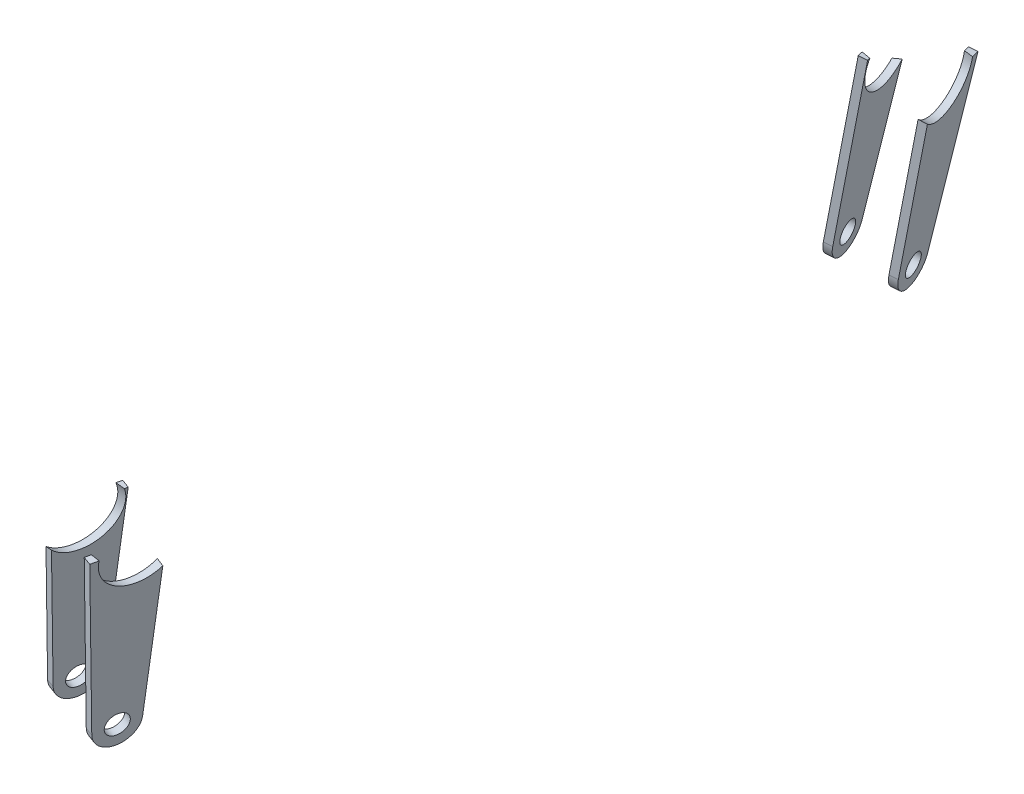
ISO-10303-21;
HEADER;
FILE_DESCRIPTION(('STEP AP214'),'2;1');
FILE_NAME('part.step','',(''),(''),'','','');
FILE_SCHEMA(('AUTOMOTIVE_DESIGN { 1 0 10303 214 1 1 1 1 }'));
ENDSEC;
DATA;
#1=APPLICATION_CONTEXT('core data for automotive mechanical design processes');
#2=APPLICATION_PROTOCOL_DEFINITION('international standard','automotive_design',2000,#1);
#3=PRODUCT_CONTEXT('',#1,'mechanical');
#4=PRODUCT('Part','Part','',(#3));
#5=PRODUCT_RELATED_PRODUCT_CATEGORY('part','',(#4));
#6=PRODUCT_DEFINITION_FORMATION('','',#4);
#7=PRODUCT_DEFINITION_CONTEXT('part definition',#1,'design');
#8=PRODUCT_DEFINITION('design','',#6,#7);
#9=PRODUCT_DEFINITION_SHAPE('','',#8);
#10=(LENGTH_UNIT() NAMED_UNIT(*) SI_UNIT(.MILLI.,.METRE.));
#11=(NAMED_UNIT(*) PLANE_ANGLE_UNIT() SI_UNIT($,.RADIAN.));
#12=(NAMED_UNIT(*) SI_UNIT($,.STERADIAN.) SOLID_ANGLE_UNIT());
#13=UNCERTAINTY_MEASURE_WITH_UNIT(LENGTH_MEASURE(1.E-05),#10,'distance_accuracy_value','');
#14=(GEOMETRIC_REPRESENTATION_CONTEXT(3) GLOBAL_UNCERTAINTY_ASSIGNED_CONTEXT((#13)) GLOBAL_UNIT_ASSIGNED_CONTEXT((#10,
#11,#12)) REPRESENTATION_CONTEXT('',''));
#15=CARTESIAN_POINT('',(0.,0.,0.));
#16=DIRECTION('',(0.,0.,1.));
#17=DIRECTION('',(1.,0.,0.));
#18=AXIS2_PLACEMENT_3D('',#15,#16,#17);
#19=CARTESIAN_POINT('',(1065.05049766154,119.041943768487,147.043758831216));
#20=DIRECTION('',(0.954125194871391,-0.170161980707227,0.246353430731994));
#21=DIRECTION('',(0.24999939562621,0.,-0.968245992600295));
#22=AXIS2_PLACEMENT_3D('',#19,#20,#21);
#23=CYLINDRICAL_SURFACE('',#22,8.00000000000002);
#24=CARTESIAN_POINT('',(1067.91287324616,118.531457826365,147.782819123412));
#25=DIRECTION('',(-0.954125194871391,0.170161980707226,-0.246353430731995));
#26=DIRECTION('',(-0.249999395626211,0.,0.968245992600295));
#27=AXIS2_PLACEMENT_3D('',#24,#25,#26);
#28=CIRCLE('',#27,8.00000000000002);
#29=CARTESIAN_POINT('',(1069.89582801164,118.430520316687,140.033128676873));
#30=VERTEX_POINT('',#29);
#31=CARTESIAN_POINT('',(1065.78095925562,117.670985608352,155.445359844281));
#32=VERTEX_POINT('',#31);
#33=EDGE_CURVE('E60',#30,#32,#28,.T.);
#34=ORIENTED_EDGE('',*,*,#33,.T.);
#35=DIRECTION('',(0.954125194871391,-0.170161980707227,0.246353430731994));
#36=VECTOR('',#35,1.);
#37=CARTESIAN_POINT('',(1062.91858367101,118.181471550474,154.706299552085));
#38=LINE('',#37,#36);
#39=CARTESIAN_POINT('',(1062.91858367101,118.181471550474,154.706299552085));
#40=VERTEX_POINT('',#39);
#41=EDGE_CURVE('E108',#40,#32,#38,.T.);
#42=ORIENTED_EDGE('',*,*,#41,.F.);
#43=CARTESIAN_POINT('',(1065.05049766154,119.041943768487,147.043758831216));
#44=DIRECTION('',(-0.954125194871391,0.170161980707226,-0.246353430731995));
#45=DIRECTION('',(-0.249999395626211,0.,0.968245992600295));
#46=AXIS2_PLACEMENT_3D('',#43,#44,#45);
#47=CIRCLE('',#46,8.00000000000002);
#48=CARTESIAN_POINT('',(1067.03345242703,118.941006258809,139.294068384677));
#49=VERTEX_POINT('',#48);
#50=EDGE_CURVE('E127',#49,#40,#47,.T.);
#51=ORIENTED_EDGE('',*,*,#50,.F.);
#52=DIRECTION('',(0.954125194871391,-0.170161980707227,0.246353430731994));
#53=VECTOR('',#52,1.);
#54=CARTESIAN_POINT('',(1067.03345242703,118.941006258809,139.294068384677));
#55=LINE('',#54,#53);
#56=EDGE_CURVE('E126',#49,#30,#55,.T.);
#57=ORIENTED_EDGE('',*,*,#56,.T.);
#58=EDGE_LOOP('',(#34,#42,#51,#57));
#59=FACE_BOUND('',#58,.T.);
#60=ADVANCED_FACE('F50',(#59),#23,.T.);
#61=CARTESIAN_POINT('',(1024.19346878971,-159.738488235706,112.722702968816));
#62=DIRECTION('',(-0.266489248817151,-0.107559027251607,0.957817590108659));
#63=DIRECTION('',(0.916685898360171,-0.335302185966361,0.217392290189384));
#64=AXIS2_PLACEMENT_3D('',#61,#62,#63);
#65=PLANE('',#64);
#66=DIRECTION('',(-0.136486602919482,-0.979528435512967,-0.147971116252524));
#67=VECTOR('',#66,1.);
#68=CARTESIAN_POINT('',(1024.19346878971,-159.738488235706,112.722702968816));
#69=LINE('',#68,#67);
#70=CARTESIAN_POINT('',(1070.14370431945,170.034261302594,162.539369938052));
#71=VERTEX_POINT('',#70);
#72=EDGE_CURVE('E116',#71,#40,#69,.T.);
#73=ORIENTED_EDGE('',*,*,#72,.T.);
#74=ORIENTED_EDGE('',*,*,#41,.T.);
#75=DIRECTION('',(-0.136486602919482,-0.979528435512967,-0.147971116252524));
#76=VECTOR('',#75,1.);
#77=CARTESIAN_POINT('',(1027.05584437433,-160.248974177827,113.461763261012));
#78=LINE('',#77,#76);
#79=CARTESIAN_POINT('',(1073.18239747289,170.789160157596,163.469583844713));
#80=VERTEX_POINT('',#79);
#81=EDGE_CURVE('E54',#80,#32,#78,.T.);
#82=ORIENTED_EDGE('',*,*,#81,.F.);
#83=CARTESIAN_POINT('',(1036.08419895906,180.045029610102,154.187316707885));
#84=DIRECTION('',(0.266489248817151,0.107559027251607,-0.957817590108659));
#85=DIRECTION('',(-0.963835932642089,0.0277353815954449,-0.265049134229317));
#86=AXIS2_PLACEMENT_3D('',#83,#84,#85);
#87=ELLIPSE('',#86,50.5593865311846,12.7);
#88=EDGE_CURVE('E105',#71,#80,#87,.F.);
#89=ORIENTED_EDGE('',*,*,#88,.F.);
#90=EDGE_LOOP('',(#73,#74,#82,#89));
#91=FACE_BOUND('',#90,.T.);
#92=ADVANCED_FACE('F52',(#91),#65,.T.);
#93=CARTESIAN_POINT('',(1040.93240170606,180.21644974225,282.707621962443));
#94=DIRECTION('',(0.155305579184682,0.98472843470482,0.0786771056782485));
#95=DIRECTION('',(0.861275608896956,-0.173980321013036,0.477425568460027));
#96=AXIS2_PLACEMENT_3D('',#93,#94,#95);
#97=PLANE('',#96);
#98=DIRECTION('',(-0.255979080367402,-0.0368077465432099,0.965981314627084));
#99=VECTOR('',#98,1.);
#100=CARTESIAN_POINT('',(1043.79477729067,179.705963800129,283.446682254639));
#101=LINE('',#100,#99);
#102=CARTESIAN_POINT('',(1081.25814010637,185.092896049425,142.072205828214));
#103=VERTEX_POINT('',#102);
#104=CARTESIAN_POINT('',(1080.95240597408,185.048933923947,143.225946433169));
#105=VERTEX_POINT('',#104);
#106=EDGE_CURVE('E103',#103,#105,#101,.T.);
#107=ORIENTED_EDGE('',*,*,#106,.F.);
#108=DIRECTION('',(0.954125194871391,-0.170161980707227,0.246353430731994));
#109=VECTOR('',#108,1.);
#110=CARTESIAN_POINT('',(1078.39576452176,185.603381991547,141.333145536018));
#111=LINE('',#110,#109);
#112=CARTESIAN_POINT('',(1078.39576452176,185.603381991547,141.333145536018));
#113=VERTEX_POINT('',#112);
#114=EDGE_CURVE('E113',#113,#103,#111,.T.);
#115=ORIENTED_EDGE('',*,*,#114,.F.);
#116=DIRECTION('',(-0.255979080367402,-0.0368077465432099,0.965981314627084));
#117=VECTOR('',#116,1.);
#118=CARTESIAN_POINT('',(1040.93240170606,180.21644974225,282.707621962443));
#119=LINE('',#118,#117);
#120=CARTESIAN_POINT('',(1077.8501571475,185.524928010405,143.392089289945));
#121=VERTEX_POINT('',#120);
#122=EDGE_CURVE('E119',#113,#121,#119,.T.);
#123=ORIENTED_EDGE('',*,*,#122,.T.);
#124=CARTESIAN_POINT('',(1106.48135809248,180.057111293926,155.310796045531));
#125=DIRECTION('',(-0.155305579184682,-0.98472843470482,-0.0786771056782485));
#126=DIRECTION('',(-0.987738570410359,0.156073782579999,-0.00367299807664592));
#127=AXIS2_PLACEMENT_3D('',#124,#125,#126);
#128=ELLIPSE('',#127,81.0412885975428,12.7);
#129=EDGE_CURVE('E112',#105,#121,#128,.F.);
#130=ORIENTED_EDGE('',*,*,#129,.F.);
#131=EDGE_LOOP('',(#107,#115,#123,#130));
#132=FACE_BOUND('',#131,.T.);
#133=ADVANCED_FACE('F146',(#132),#97,.T.);
#134=CARTESIAN_POINT('',(1065.05049766154,119.041943768487,147.043758831216));
#135=DIRECTION('',(0.954125194871391,-0.170161980707227,0.246353430731994));
#136=DIRECTION('',(0.24999939562621,0.,-0.968245992600295));
#137=AXIS2_PLACEMENT_3D('',#134,#135,#136);
#138=CYLINDRICAL_SURFACE('',#137,4.09999999999999);
#139=CARTESIAN_POINT('',(1065.05049766154,119.041943768487,147.043758831216));
#140=DIRECTION('',(-0.954125194871391,0.170161980707226,-0.246353430731995));
#141=DIRECTION('',(-0.249999395626211,0.,0.968245992600295));
#142=AXIS2_PLACEMENT_3D('',#139,#140,#141);
#143=CIRCLE('',#142,4.09999999999999);
#144=CARTESIAN_POINT('',(1064.02550013948,119.041943768487,151.013567400877));
#145=VERTEX_POINT('',#144);
#146=EDGE_CURVE('E121',#145,#145,#143,.T.);
#147=ORIENTED_EDGE('',*,*,#146,.T.);
#148=EDGE_LOOP('',(#147));
#149=FACE_BOUND('',#148,.T.);
#150=CARTESIAN_POINT('',(1067.91287324616,118.531457826365,147.782819123412));
#151=DIRECTION('',(-0.954125194871391,0.170161980707226,-0.246353430731995));
#152=DIRECTION('',(-0.249999395626211,0.,0.968245992600295));
#153=AXIS2_PLACEMENT_3D('',#150,#151,#152);
#154=CIRCLE('',#153,4.09999999999999);
#155=CARTESIAN_POINT('',(1066.88787572409,118.531457826365,151.752627693073));
#156=VERTEX_POINT('',#155);
#157=EDGE_CURVE('E131',#156,#156,#154,.T.);
#158=ORIENTED_EDGE('',*,*,#157,.F.);
#159=EDGE_LOOP('',(#158));
#160=FACE_BOUND('',#159,.T.);
#161=ADVANCED_FACE('F157',(#149,#160),#138,.F.);
#162=CARTESIAN_POINT('',(1016.54898779805,-177.249973332799,130.234141367676));
#163=DIRECTION('',(0.247869345685855,-0.0126171887097613,-0.968711305817336));
#164=DIRECTION('',(-0.911627781661277,0.335359916460764,-0.237631046235059));
#165=AXIS2_PLACEMENT_3D('',#162,#163,#164);
#166=PLANE('',#165);
#167=DIRECTION('',(0.167946122256204,0.985335327120091,0.0301395611820792));
#168=VECTOR('',#167,1.);
#169=CARTESIAN_POINT('',(1019.41136338267,-177.76045927492,130.973201659872));
#170=LINE('',#169,#168);
#171=EDGE_CURVE('E134',#30,#103,#170,.T.);
#172=ORIENTED_EDGE('',*,*,#171,.F.);
#173=ORIENTED_EDGE('',*,*,#56,.F.);
#174=DIRECTION('',(0.167946122256204,0.985335327120091,0.0301395611820792));
#175=VECTOR('',#174,1.);
#176=CARTESIAN_POINT('',(1016.54898779805,-177.249973332799,130.234141367676));
#177=LINE('',#176,#175);
#178=EDGE_CURVE('E118',#49,#113,#177,.T.);
#179=ORIENTED_EDGE('',*,*,#178,.T.);
#180=ORIENTED_EDGE('',*,*,#114,.T.);
#181=EDGE_LOOP('',(#172,#173,#179,#180));
#182=FACE_BOUND('',#181,.T.);
#183=ADVANCED_FACE('F143',(#182),#166,.T.);
#184=CARTESIAN_POINT('',(984.809703847201,-175.634361954907,254.276116452012));
#185=DIRECTION('',(-0.954125194871391,0.170161980707226,-0.246353430731995));
#186=DIRECTION('',(-0.249999395626211,0.,0.968245992600295));
#187=AXIS2_PLACEMENT_3D('',#184,#185,#186);
#188=PLANE('',#187);
#189=ORIENTED_EDGE('',*,*,#146,.F.);
#190=EDGE_LOOP('',(#189));
#191=FACE_BOUND('',#190,.T.);
#192=ORIENTED_EDGE('',*,*,#122,.F.);
#193=ORIENTED_EDGE('',*,*,#178,.F.);
#194=ORIENTED_EDGE('',*,*,#50,.T.);
#195=ORIENTED_EDGE('',*,*,#72,.F.);
#196=CARTESIAN_POINT('',(1073.93075150633,180.051524901778,154.79131579409));
#197=DIRECTION('',(0.954125194871391,-0.170161980707226,0.246353430731995));
#198=DIRECTION('',(-0.299253817865106,-0.568373905829343,0.766419112278298));
#199=AXIS2_PLACEMENT_3D('',#196,#197,#198);
#200=ELLIPSE('',#199,13.2580915210369,12.7);
#201=EDGE_CURVE('E68',#121,#71,#200,.F.);
#202=ORIENTED_EDGE('',*,*,#201,.F.);
#203=EDGE_LOOP('',(#192,#193,#194,#195,#202));
#204=FACE_BOUND('',#203,.T.);
#205=ADVANCED_FACE('F147',(#191,#204),#188,.T.);
#206=CARTESIAN_POINT('',(987.672079431815,-176.144847897029,255.015176744208));
#207=DIRECTION('',(-0.954125194871391,0.170161980707226,-0.246353430731995));
#208=DIRECTION('',(-0.249999395626211,0.,0.968245992600295));
#209=AXIS2_PLACEMENT_3D('',#206,#207,#208);
#210=PLANE('',#209);
#211=CARTESIAN_POINT('',(1077.06218534857,180.052062323942,154.841290839422));
#212=DIRECTION('',(0.954125194871391,-0.170161980707226,0.246353430731995));
#213=DIRECTION('',(-0.299253817865106,-0.568373905829343,0.766419112278298));
#214=AXIS2_PLACEMENT_3D('',#211,#212,#213);
#215=ELLIPSE('',#214,13.2580915210369,12.7);
#216=EDGE_CURVE('E12',#105,#80,#215,.F.);
#217=ORIENTED_EDGE('',*,*,#216,.T.);
#218=ORIENTED_EDGE('',*,*,#81,.T.);
#219=ORIENTED_EDGE('',*,*,#33,.F.);
#220=ORIENTED_EDGE('',*,*,#171,.T.);
#221=ORIENTED_EDGE('',*,*,#106,.T.);
#222=EDGE_LOOP('',(#217,#218,#219,#220,#221));
#223=FACE_BOUND('',#222,.T.);
#224=ORIENTED_EDGE('',*,*,#157,.T.);
#225=EDGE_LOOP('',(#224));
#226=FACE_BOUND('',#225,.T.);
#227=ADVANCED_FACE('F97',(#223,#226),#210,.F.);
#228=CARTESIAN_POINT('',(1400.,180.107485477653,159.995106228733));
#229=DIRECTION('',(-0.999872662248254,-0.000171599898609785,-0.015957125118991));
#230=DIRECTION('',(0.015957125353932,0.,-0.999872676969642));
#231=AXIS2_PLACEMENT_3D('',#228,#229,#230);
#232=CYLINDRICAL_SURFACE('',#231,12.7);
#233=ORIENTED_EDGE('',*,*,#129,.T.);
#234=ORIENTED_EDGE('',*,*,#201,.T.);
#235=ORIENTED_EDGE('',*,*,#88,.T.);
#236=ORIENTED_EDGE('',*,*,#216,.F.);
#237=EDGE_LOOP('',(#233,#234,#235,#236));
#238=FACE_BOUND('',#237,.T.);
#239=ADVANCED_FACE('F106',(#238),#232,.F.);
#240=CLOSED_SHELL('',(#60,#92,#133,#161,#183,#205,#227,#239));
#241=MANIFOLD_SOLID_BREP('B2',#240);
#242=CARTESIAN_POINT('',(1087.94950233846,114.958056231513,152.956241168784));
#243=DIRECTION('',(-0.954125194871391,0.170161980707227,-0.246353430731994));
#244=DIRECTION('',(0.24999939562621,0.,-0.968245992600295));
#245=AXIS2_PLACEMENT_3D('',#242,#243,#244);
#246=CYLINDRICAL_SURFACE('',#245,8.00000000000002);
#247=CARTESIAN_POINT('',(1085.08712675384,115.468542173635,152.217180876588));
#248=DIRECTION('',(-0.954125194871391,0.170161980707228,-0.246353430731994));
#249=DIRECTION('',(-0.249999395626209,0.,0.968245992600295));
#250=AXIS2_PLACEMENT_3D('',#247,#248,#249);
#251=CIRCLE('',#250,8.00000000000002);
#252=CARTESIAN_POINT('',(1087.07008151933,115.367604663957,144.467490430049));
#253=VERTEX_POINT('',#252);
#254=CARTESIAN_POINT('',(1082.95521276331,114.608069955622,159.879721597457));
#255=VERTEX_POINT('',#254);
#256=EDGE_CURVE('E323',#253,#255,#251,.T.);
#257=ORIENTED_EDGE('',*,*,#256,.F.);
#258=DIRECTION('',(-0.954125194871391,0.170161980707227,-0.246353430731994));
#259=VECTOR('',#258,1.);
#260=CARTESIAN_POINT('',(1089.93245710394,114.857118721835,145.206550722245));
#261=LINE('',#260,#259);
#262=CARTESIAN_POINT('',(1089.93245710394,114.857118721835,145.206550722245));
#263=VERTEX_POINT('',#262);
#264=EDGE_CURVE('E300',#263,#253,#261,.T.);
#265=ORIENTED_EDGE('',*,*,#264,.F.);
#266=CARTESIAN_POINT('',(1087.94950233846,114.958056231513,152.956241168784));
#267=DIRECTION('',(-0.954125194871391,0.170161980707228,-0.246353430731994));
#268=DIRECTION('',(-0.249999395626209,0.,0.968245992600295));
#269=AXIS2_PLACEMENT_3D('',#266,#267,#268);
#270=CIRCLE('',#269,8.00000000000002);
#271=CARTESIAN_POINT('',(1085.81758834792,114.0975840135,160.618781889653));
#272=VERTEX_POINT('',#271);
#273=EDGE_CURVE('E316',#263,#272,#270,.T.);
#274=ORIENTED_EDGE('',*,*,#273,.T.);
#275=DIRECTION('',(-0.954125194871391,0.170161980707227,-0.246353430731994));
#276=VECTOR('',#275,1.);
#277=CARTESIAN_POINT('',(1085.81758834792,114.0975840135,160.618781889653));
#278=LINE('',#277,#276);
#279=EDGE_CURVE('E314',#272,#255,#278,.T.);
#280=ORIENTED_EDGE('',*,*,#279,.T.);
#281=EDGE_LOOP('',(#257,#265,#274,#280));
#282=FACE_BOUND('',#281,.T.);
#283=ADVANCED_FACE('F239',(#282),#246,.T.);
#284=CARTESIAN_POINT('',(1047.09247346662,-163.822375772679,118.635185306384));
#285=DIRECTION('',(-0.266489248817151,-0.107559027251607,0.957817590108659));
#286=DIRECTION('',(-0.963406600541787,0.,-0.268044253869613));
#287=AXIS2_PLACEMENT_3D('',#284,#285,#286);
#288=PLANE('',#287);
#289=DIRECTION('',(-0.136486602919484,-0.979528435512967,-0.147971116252525));
#290=VECTOR('',#289,1.);
#291=CARTESIAN_POINT('',(1044.23009788201,-163.311889830557,117.896125014188));
#292=LINE('',#291,#290);
#293=CARTESIAN_POINT('',(1092.22535731703,181.137458169966,169.929892149697));
#294=VERTEX_POINT('',#293);
#295=EDGE_CURVE('E302',#294,#255,#292,.T.);
#296=ORIENTED_EDGE('',*,*,#295,.T.);
#297=ORIENTED_EDGE('',*,*,#279,.F.);
#298=DIRECTION('',(-0.136486602919484,-0.979528435512967,-0.147971116252525));
#299=VECTOR('',#298,1.);
#300=CARTESIAN_POINT('',(1047.09247346662,-163.822375772679,118.635185306384));
#301=LINE('',#300,#299);
#302=CARTESIAN_POINT('',(1095.08773290164,180.626972227844,170.668952441893));
#303=VERTEX_POINT('',#302);
#304=EDGE_CURVE('E321',#303,#272,#301,.T.);
#305=ORIENTED_EDGE('',*,*,#304,.F.);
#306=DIRECTION('',(-0.954125194871391,0.170161980707227,-0.246353430731994));
#307=VECTOR('',#306,1.);
#308=CARTESIAN_POINT('',(1095.08773290164,180.626972227844,170.668952441893));
#309=LINE('',#308,#307);
#310=EDGE_CURVE('E309',#303,#294,#309,.T.);
#311=ORIENTED_EDGE('',*,*,#310,.T.);
#312=EDGE_LOOP('',(#296,#297,#305,#311));
#313=FACE_BOUND('',#312,.T.);
#314=ADVANCED_FACE('F334',(#313),#288,.T.);
#315=CARTESIAN_POINT('',(1063.83140638297,176.132562205277,288.620104300011));
#316=DIRECTION('',(0.155305579184682,0.98472843470482,0.0786771056782485));
#317=DIRECTION('',(-0.987790434916609,0.155788499855596,0.));
#318=AXIS2_PLACEMENT_3D('',#315,#316,#317);
#319=PLANE('',#318);
#320=DIRECTION('',(-0.255979080367401,-0.0368077465432101,0.965981314627085));
#321=VECTOR('',#320,1.);
#322=CARTESIAN_POINT('',(1060.96903079836,176.643048147398,287.881044007815));
#323=LINE('',#322,#321);
#324=CARTESIAN_POINT('',(1092.80553140233,181.220882567976,167.740504935589));
#325=VERTEX_POINT('',#324);
#326=EDGE_CURVE('E243',#325,#294,#323,.T.);
#327=ORIENTED_EDGE('',*,*,#326,.T.);
#328=ORIENTED_EDGE('',*,*,#310,.F.);
#329=DIRECTION('',(-0.255979080367401,-0.0368077465432101,0.965981314627085));
#330=VECTOR('',#329,1.);
#331=CARTESIAN_POINT('',(1063.83140638297,176.132562205277,288.620104300011));
#332=LINE('',#331,#330);
#333=CARTESIAN_POINT('',(1095.84152486576,180.735361489661,167.824388146231));
#334=VERTEX_POINT('',#333);
#335=EDGE_CURVE('E307',#334,#303,#332,.T.);
#336=ORIENTED_EDGE('',*,*,#335,.F.);
#337=CARTESIAN_POINT('',(1106.48135809248,180.057111293926,155.310796045531));
#338=DIRECTION('',(-0.155305579184682,-0.98472843470482,-0.0786771056782485));
#339=DIRECTION('',(-0.987738570410359,0.156073782579999,-0.00367299807664592));
#340=AXIS2_PLACEMENT_3D('',#337,#338,#339);
#341=ELLIPSE('',#340,81.0412885975428,12.7);
#342=EDGE_CURVE('E310',#325,#334,#341,.F.);
#343=ORIENTED_EDGE('',*,*,#342,.F.);
#344=EDGE_LOOP('',(#327,#328,#336,#343));
#345=FACE_BOUND('',#344,.T.);
#346=ADVANCED_FACE('F241',(#345),#319,.T.);
#347=CARTESIAN_POINT('',(1087.94950233846,114.958056231513,152.956241168784));
#348=DIRECTION('',(-0.954125194871391,0.170161980707227,-0.246353430731994));
#349=DIRECTION('',(0.24999939562621,0.,-0.968245992600295));
#350=AXIS2_PLACEMENT_3D('',#347,#348,#349);
#351=CYLINDRICAL_SURFACE('',#350,4.09999999999999);
#352=CARTESIAN_POINT('',(1087.94950233846,114.958056231513,152.956241168784));
#353=DIRECTION('',(-0.954125194871391,0.170161980707228,-0.246353430731994));
#354=DIRECTION('',(-0.249999395626209,0.,0.968245992600295));
#355=AXIS2_PLACEMENT_3D('',#352,#353,#354);
#356=CIRCLE('',#355,4.09999999999999);
#357=CARTESIAN_POINT('',(1086.92450481639,114.958056231513,156.926049738445));
#358=VERTEX_POINT('',#357);
#359=EDGE_CURVE('E311',#358,#358,#356,.T.);
#360=ORIENTED_EDGE('',*,*,#359,.F.);
#361=EDGE_LOOP('',(#360));
#362=FACE_BOUND('',#361,.T.);
#363=CARTESIAN_POINT('',(1085.08712675384,115.468542173635,152.217180876588));
#364=DIRECTION('',(-0.954125194871391,0.170161980707228,-0.246353430731994));
#365=DIRECTION('',(-0.249999395626209,0.,0.968245992600295));
#366=AXIS2_PLACEMENT_3D('',#363,#364,#365);
#367=CIRCLE('',#366,4.09999999999999);
#368=CARTESIAN_POINT('',(1084.06212923178,115.468542173635,156.186989446249));
#369=VERTEX_POINT('',#368);
#370=EDGE_CURVE('E249',#369,#369,#367,.T.);
#371=ORIENTED_EDGE('',*,*,#370,.T.);
#372=EDGE_LOOP('',(#371));
#373=FACE_BOUND('',#372,.T.);
#374=ADVANCED_FACE('F347',(#362,#373),#351,.F.);
#375=CARTESIAN_POINT('',(1039.44799247497,-181.333860869772,136.146623705244));
#376=DIRECTION('',(0.247869345685855,-0.0126171887097613,-0.968711305817336));
#377=DIRECTION('',(0.968788421272532,0.,0.247889077630045));
#378=AXIS2_PLACEMENT_3D('',#375,#376,#377);
#379=PLANE('',#378);
#380=DIRECTION('',(0.167946122256206,0.98533532712009,0.0301395611820796));
#381=VECTOR('',#380,1.);
#382=CARTESIAN_POINT('',(1039.44799247497,-181.333860869772,136.146623705244));
#383=LINE('',#382,#381);
#384=CARTESIAN_POINT('',(1099.40545939595,170.434965276493,146.906572897943));
#385=VERTEX_POINT('',#384);
#386=EDGE_CURVE('E296',#263,#385,#383,.T.);
#387=ORIENTED_EDGE('',*,*,#386,.F.);
#388=ORIENTED_EDGE('',*,*,#264,.T.);
#389=DIRECTION('',(0.167946122256206,0.98533532712009,0.0301395611820796));
#390=VECTOR('',#389,1.);
#391=CARTESIAN_POINT('',(1036.58561689035,-180.82337492765,135.407563413048));
#392=LINE('',#391,#390);
#393=CARTESIAN_POINT('',(1096.56513095969,171.074801237785,146.171469180437));
#394=VERTEX_POINT('',#393);
#395=EDGE_CURVE('E289',#253,#394,#392,.T.);
#396=ORIENTED_EDGE('',*,*,#395,.T.);
#397=CARTESIAN_POINT('',(1134.48723499274,180.061917711601,155.757746240929));
#398=DIRECTION('',(-0.247869345685855,0.0126171887097613,0.968711305817336));
#399=DIRECTION('',(-0.968793469304313,-0.0031909031085728,-0.247848808693255));
#400=AXIS2_PLACEMENT_3D('',#397,#398,#399);
#401=ELLIPSE('',#400,54.6523878046146,12.7);
#402=EDGE_CURVE('E293',#385,#394,#401,.F.);
#403=ORIENTED_EDGE('',*,*,#402,.F.);
#404=EDGE_LOOP('',(#387,#388,#396,#403));
#405=FACE_BOUND('',#404,.T.);
#406=ADVANCED_FACE('F298',(#405),#379,.T.);
#407=CARTESIAN_POINT('',(1007.70870852411,-179.718249491881,260.18859878958));
#408=DIRECTION('',(0.954125194871391,-0.170161980707228,0.246353430731994));
#409=DIRECTION('',(-0.249999395626209,0.,0.968245992600295));
#410=AXIS2_PLACEMENT_3D('',#407,#408,#409);
#411=PLANE('',#410);
#412=ORIENTED_EDGE('',*,*,#359,.T.);
#413=EDGE_LOOP('',(#412));
#414=FACE_BOUND('',#413,.T.);
#415=ORIENTED_EDGE('',*,*,#335,.T.);
#416=ORIENTED_EDGE('',*,*,#304,.T.);
#417=ORIENTED_EDGE('',*,*,#273,.F.);
#418=ORIENTED_EDGE('',*,*,#386,.T.);
#419=CARTESIAN_POINT('',(1098.98222224423,180.05582427909,155.191116156749));
#420=DIRECTION('',(-0.954125194871391,0.170161980707228,-0.246353430731994));
#421=DIRECTION('',(-0.299253817865106,-0.568373905829349,0.766419112278294));
#422=AXIS2_PLACEMENT_3D('',#419,#420,#421);
#423=ELLIPSE('',#422,13.2580915210369,12.7);
#424=EDGE_CURVE('E258',#334,#385,#423,.F.);
#425=ORIENTED_EDGE('',*,*,#424,.F.);
#426=EDGE_LOOP('',(#415,#416,#417,#418,#425));
#427=FACE_BOUND('',#426,.T.);
#428=ADVANCED_FACE('F338',(#414,#427),#411,.T.);
#429=CARTESIAN_POINT('',(1004.8463329395,-179.207763549759,259.449538497384));
#430=DIRECTION('',(0.954125194871391,-0.170161980707228,0.246353430731994));
#431=DIRECTION('',(-0.249999395626209,0.,0.968245992600295));
#432=AXIS2_PLACEMENT_3D('',#429,#430,#431);
#433=PLANE('',#432);
#434=CARTESIAN_POINT('',(1095.85078840199,180.055286856926,155.141141111416));
#435=DIRECTION('',(-0.954125194871391,0.170161980707228,-0.246353430731994));
#436=DIRECTION('',(-0.299253817865106,-0.568373905829349,0.766419112278294));
#437=AXIS2_PLACEMENT_3D('',#434,#435,#436);
#438=ELLIPSE('',#437,13.2580915210369,12.7);
#439=EDGE_CURVE('E48',#325,#394,#438,.F.);
#440=ORIENTED_EDGE('',*,*,#439,.T.);
#441=ORIENTED_EDGE('',*,*,#395,.F.);
#442=ORIENTED_EDGE('',*,*,#256,.T.);
#443=ORIENTED_EDGE('',*,*,#295,.F.);
#444=ORIENTED_EDGE('',*,*,#326,.F.);
#445=EDGE_LOOP('',(#440,#441,#442,#443,#444));
#446=FACE_BOUND('',#445,.T.);
#447=ORIENTED_EDGE('',*,*,#370,.F.);
#448=EDGE_LOOP('',(#447));
#449=FACE_BOUND('',#448,.T.);
#450=ADVANCED_FACE('F285',(#446,#449),#433,.F.);
#451=CARTESIAN_POINT('',(1400.,180.107485477653,159.995106228733));
#452=DIRECTION('',(-0.999872662248254,-0.000171599898609785,-0.015957125118991));
#453=DIRECTION('',(0.015957125353932,0.,-0.999872676969642));
#454=AXIS2_PLACEMENT_3D('',#451,#452,#453);
#455=CYLINDRICAL_SURFACE('',#454,12.7);
#456=ORIENTED_EDGE('',*,*,#342,.T.);
#457=ORIENTED_EDGE('',*,*,#424,.T.);
#458=ORIENTED_EDGE('',*,*,#402,.T.);
#459=ORIENTED_EDGE('',*,*,#439,.F.);
#460=EDGE_LOOP('',(#456,#457,#458,#459));
#461=FACE_BOUND('',#460,.T.);
#462=ADVANCED_FACE('F294',(#461),#455,.F.);
#463=CLOSED_SHELL('',(#283,#314,#346,#374,#406,#428,#450,#462));
#464=MANIFOLD_SOLID_BREP('B6',#463);
#465=CARTESIAN_POINT('',(1065.05049766154,119.041943768487,-147.043758831216));
#466=DIRECTION('',(0.954125194871391,-0.170161980707227,-0.246353430731994));
#467=DIRECTION('',(0.24999939562621,0.,0.968245992600295));
#468=AXIS2_PLACEMENT_3D('',#465,#466,#467);
#469=CYLINDRICAL_SURFACE('',#468,8.00000000000002);
#470=CARTESIAN_POINT('',(1067.91287324616,118.531457826365,-147.782819123412));
#471=DIRECTION('',(0.954125194871391,-0.170161980707226,-0.246353430731995));
#472=DIRECTION('',(-0.249999395626211,0.,-0.968245992600295));
#473=AXIS2_PLACEMENT_3D('',#470,#471,#472);
#474=CIRCLE('',#473,8.00000000000002);
#475=CARTESIAN_POINT('',(1069.89582801164,118.430520316687,-140.033128676873));
#476=VERTEX_POINT('',#475);
#477=CARTESIAN_POINT('',(1065.78095925562,117.670985608352,-155.445359844281));
#478=VERTEX_POINT('',#477);
#479=EDGE_CURVE('E437',#476,#478,#474,.T.);
#480=ORIENTED_EDGE('',*,*,#479,.F.);
#481=DIRECTION('',(0.954125194871391,-0.170161980707227,-0.246353430731994));
#482=VECTOR('',#481,1.);
#483=CARTESIAN_POINT('',(1067.03345242703,118.941006258809,-139.294068384677));
#484=LINE('',#483,#482);
#485=CARTESIAN_POINT('',(1067.03345242703,118.941006258809,-139.294068384677));
#486=VERTEX_POINT('',#485);
#487=EDGE_CURVE('E503',#486,#476,#484,.T.);
#488=ORIENTED_EDGE('',*,*,#487,.F.);
#489=CARTESIAN_POINT('',(1065.05049766154,119.041943768487,-147.043758831216));
#490=DIRECTION('',(0.954125194871391,-0.170161980707226,-0.246353430731995));
#491=DIRECTION('',(-0.249999395626211,0.,-0.968245992600295));
#492=AXIS2_PLACEMENT_3D('',#489,#490,#491);
#493=CIRCLE('',#492,8.00000000000002);
#494=CARTESIAN_POINT('',(1062.91858367101,118.181471550474,-154.706299552085));
#495=VERTEX_POINT('',#494);
#496=EDGE_CURVE('E504',#486,#495,#493,.T.);
#497=ORIENTED_EDGE('',*,*,#496,.T.);
#498=DIRECTION('',(0.954125194871391,-0.170161980707227,-0.246353430731994));
#499=VECTOR('',#498,1.);
#500=CARTESIAN_POINT('',(1062.91858367101,118.181471550474,-154.706299552085));
#501=LINE('',#500,#499);
#502=EDGE_CURVE('E482',#495,#478,#501,.T.);
#503=ORIENTED_EDGE('',*,*,#502,.T.);
#504=EDGE_LOOP('',(#480,#488,#497,#503));
#505=FACE_BOUND('',#504,.T.);
#506=ADVANCED_FACE('F427',(#505),#469,.T.);
#507=CARTESIAN_POINT('',(1024.19346878971,-159.738488235706,-112.722702968816));
#508=DIRECTION('',(-0.266489248817151,-0.107559027251607,-0.957817590108659));
#509=DIRECTION('',(0.916685898360171,-0.335302185966361,-0.217392290189384));
#510=AXIS2_PLACEMENT_3D('',#507,#508,#509);
#511=PLANE('',#510);
#512=DIRECTION('',(-0.136486602919482,-0.979528435512967,0.147971116252524));
#513=VECTOR('',#512,1.);
#514=CARTESIAN_POINT('',(1024.19346878971,-159.738488235706,-112.722702968816));
#515=LINE('',#514,#513);
#516=CARTESIAN_POINT('',(1070.14370431945,170.034261302594,-162.539369938052));
#517=VERTEX_POINT('',#516);
#518=EDGE_CURVE('E481',#517,#495,#515,.T.);
#519=ORIENTED_EDGE('',*,*,#518,.F.);
#520=CARTESIAN_POINT('',(1036.08419895906,180.045029610102,-154.187316707885));
#521=DIRECTION('',(-0.266489248817151,-0.107559027251607,-0.957817590108659));
#522=DIRECTION('',(-0.963835932642089,0.0277353815954449,0.265049134229317));
#523=AXIS2_PLACEMENT_3D('',#520,#521,#522);
#524=ELLIPSE('',#523,50.5593865311846,12.7);
#525=CARTESIAN_POINT('',(1073.18239747289,170.789160157596,-163.469583844713));
#526=VERTEX_POINT('',#525);
#527=EDGE_CURVE('E472',#517,#526,#524,.F.);
#528=ORIENTED_EDGE('',*,*,#527,.T.);
#529=DIRECTION('',(-0.136486602919482,-0.979528435512967,0.147971116252524));
#530=VECTOR('',#529,1.);
#531=CARTESIAN_POINT('',(1027.05584437433,-160.248974177827,-113.461763261012));
#532=LINE('',#531,#530);
#533=EDGE_CURVE('E431',#526,#478,#532,.T.);
#534=ORIENTED_EDGE('',*,*,#533,.T.);
#535=ORIENTED_EDGE('',*,*,#502,.F.);
#536=EDGE_LOOP('',(#519,#528,#534,#535));
#537=FACE_BOUND('',#536,.T.);
#538=ADVANCED_FACE('F429',(#537),#511,.T.);
#539=CARTESIAN_POINT('',(1040.93240170606,180.21644974225,-282.707621962443));
#540=DIRECTION('',(0.155305579184682,0.98472843470482,-0.0786771056782485));
#541=DIRECTION('',(0.861275608896956,-0.173980321013036,-0.477425568460027));
#542=AXIS2_PLACEMENT_3D('',#539,#540,#541);
#543=PLANE('',#542);
#544=DIRECTION('',(-0.255979080367402,-0.0368077465432099,-0.965981314627084));
#545=VECTOR('',#544,1.);
#546=CARTESIAN_POINT('',(1043.79477729067,179.705963800129,-283.446682254639));
#547=LINE('',#546,#545);
#548=CARTESIAN_POINT('',(1081.25814010637,185.092896049425,-142.072205828214));
#549=VERTEX_POINT('',#548);
#550=CARTESIAN_POINT('',(1080.95240597408,185.048933923947,-143.225946433169));
#551=VERTEX_POINT('',#550);
#552=EDGE_CURVE('E488',#549,#551,#547,.T.);
#553=ORIENTED_EDGE('',*,*,#552,.T.);
#554=CARTESIAN_POINT('',(1106.48135809248,180.057111293926,-155.310796045531));
#555=DIRECTION('',(0.155305579184682,0.98472843470482,-0.0786771056782485));
#556=DIRECTION('',(-0.987738570410359,0.156073782579999,0.00367299807664592));
#557=AXIS2_PLACEMENT_3D('',#554,#555,#556);
#558=ELLIPSE('',#557,81.0412885975428,12.7);
#559=CARTESIAN_POINT('',(1077.8501571475,185.524928010405,-143.392089289945));
#560=VERTEX_POINT('',#559);
#561=EDGE_CURVE('E468',#551,#560,#558,.F.);
#562=ORIENTED_EDGE('',*,*,#561,.T.);
#563=DIRECTION('',(-0.255979080367402,-0.0368077465432099,-0.965981314627084));
#564=VECTOR('',#563,1.);
#565=CARTESIAN_POINT('',(1040.93240170606,180.21644974225,-282.707621962443));
#566=LINE('',#565,#564);
#567=CARTESIAN_POINT('',(1078.39576452176,185.603381991547,-141.333145536018));
#568=VERTEX_POINT('',#567);
#569=EDGE_CURVE('E496',#568,#560,#566,.T.);
#570=ORIENTED_EDGE('',*,*,#569,.F.);
#571=DIRECTION('',(0.954125194871391,-0.170161980707227,-0.246353430731994));
#572=VECTOR('',#571,1.);
#573=CARTESIAN_POINT('',(1078.39576452176,185.603381991547,-141.333145536018));
#574=LINE('',#573,#572);
#575=EDGE_CURVE('E491',#568,#549,#574,.T.);
#576=ORIENTED_EDGE('',*,*,#575,.T.);
#577=EDGE_LOOP('',(#553,#562,#570,#576));
#578=FACE_BOUND('',#577,.T.);
#579=ADVANCED_FACE('F524',(#578),#543,.T.);
#580=CARTESIAN_POINT('',(1065.05049766154,119.041943768487,-147.043758831216));
#581=DIRECTION('',(0.954125194871391,-0.170161980707227,-0.246353430731994));
#582=DIRECTION('',(0.24999939562621,0.,0.968245992600295));
#583=AXIS2_PLACEMENT_3D('',#580,#581,#582);
#584=CYLINDRICAL_SURFACE('',#583,4.09999999999999);
#585=CARTESIAN_POINT('',(1065.05049766154,119.041943768487,-147.043758831216));
#586=DIRECTION('',(0.954125194871391,-0.170161980707226,-0.246353430731995));
#587=DIRECTION('',(-0.249999395626211,0.,-0.968245992600295));
#588=AXIS2_PLACEMENT_3D('',#585,#586,#587);
#589=CIRCLE('',#588,4.09999999999999);
#590=CARTESIAN_POINT('',(1064.02550013948,119.041943768487,-151.013567400877));
#591=VERTEX_POINT('',#590);
#592=EDGE_CURVE('E498',#591,#591,#589,.T.);
#593=ORIENTED_EDGE('',*,*,#592,.F.);
#594=EDGE_LOOP('',(#593));
#595=FACE_BOUND('',#594,.T.);
#596=CARTESIAN_POINT('',(1067.91287324616,118.531457826365,-147.782819123412));
#597=DIRECTION('',(0.954125194871391,-0.170161980707226,-0.246353430731995));
#598=DIRECTION('',(-0.249999395626211,0.,-0.968245992600295));
#599=AXIS2_PLACEMENT_3D('',#596,#597,#598);
#600=CIRCLE('',#599,4.09999999999999);
#601=CARTESIAN_POINT('',(1066.88787572409,118.531457826365,-151.752627693073));
#602=VERTEX_POINT('',#601);
#603=EDGE_CURVE('E508',#602,#602,#600,.T.);
#604=ORIENTED_EDGE('',*,*,#603,.T.);
#605=EDGE_LOOP('',(#604));
#606=FACE_BOUND('',#605,.T.);
#607=ADVANCED_FACE('F528',(#595,#606),#584,.F.);
#608=CARTESIAN_POINT('',(1016.54898779805,-177.249973332799,-130.234141367676));
#609=DIRECTION('',(0.247869345685855,-0.0126171887097613,0.968711305817336));
#610=DIRECTION('',(-0.911627781661277,0.335359916460764,0.237631046235059));
#611=AXIS2_PLACEMENT_3D('',#608,#609,#610);
#612=PLANE('',#611);
#613=DIRECTION('',(0.167946122256204,0.985335327120091,-0.0301395611820792));
#614=VECTOR('',#613,1.);
#615=CARTESIAN_POINT('',(1019.41136338267,-177.76045927492,-130.973201659872));
#616=LINE('',#615,#614);
#617=EDGE_CURVE('E511',#476,#549,#616,.T.);
#618=ORIENTED_EDGE('',*,*,#617,.T.);
#619=ORIENTED_EDGE('',*,*,#575,.F.);
#620=DIRECTION('',(0.167946122256204,0.985335327120091,-0.0301395611820792));
#621=VECTOR('',#620,1.);
#622=CARTESIAN_POINT('',(1016.54898779805,-177.249973332799,-130.234141367676));
#623=LINE('',#622,#621);
#624=EDGE_CURVE('E495',#486,#568,#623,.T.);
#625=ORIENTED_EDGE('',*,*,#624,.F.);
#626=ORIENTED_EDGE('',*,*,#487,.T.);
#627=EDGE_LOOP('',(#618,#619,#625,#626));
#628=FACE_BOUND('',#627,.T.);
#629=ADVANCED_FACE('F526',(#628),#612,.T.);
#630=CARTESIAN_POINT('',(984.809703847201,-175.634361954907,-254.276116452012));
#631=DIRECTION('',(-0.954125194871391,0.170161980707226,0.246353430731995));
#632=DIRECTION('',(-0.249999395626211,0.,-0.968245992600295));
#633=AXIS2_PLACEMENT_3D('',#630,#631,#632);
#634=PLANE('',#633);
#635=ORIENTED_EDGE('',*,*,#592,.T.);
#636=EDGE_LOOP('',(#635));
#637=FACE_BOUND('',#636,.T.);
#638=ORIENTED_EDGE('',*,*,#569,.T.);
#639=CARTESIAN_POINT('',(1073.93075150633,180.051524901778,-154.79131579409));
#640=DIRECTION('',(-0.954125194871391,0.170161980707226,0.246353430731995));
#641=DIRECTION('',(-0.299253817865106,-0.568373905829343,-0.766419112278298));
#642=AXIS2_PLACEMENT_3D('',#639,#640,#641);
#643=ELLIPSE('',#642,13.2580915210369,12.7);
#644=EDGE_CURVE('E445',#560,#517,#643,.F.);
#645=ORIENTED_EDGE('',*,*,#644,.T.);
#646=ORIENTED_EDGE('',*,*,#518,.T.);
#647=ORIENTED_EDGE('',*,*,#496,.F.);
#648=ORIENTED_EDGE('',*,*,#624,.T.);
#649=EDGE_LOOP('',(#638,#645,#646,#647,#648));
#650=FACE_BOUND('',#649,.T.);
#651=ADVANCED_FACE('F521',(#637,#650),#634,.T.);
#652=CARTESIAN_POINT('',(987.672079431815,-176.144847897029,-255.015176744208));
#653=DIRECTION('',(-0.954125194871391,0.170161980707226,0.246353430731995));
#654=DIRECTION('',(-0.249999395626211,0.,-0.968245992600295));
#655=AXIS2_PLACEMENT_3D('',#652,#653,#654);
#656=PLANE('',#655);
#657=CARTESIAN_POINT('',(1077.06218534857,180.052062323942,-154.841290839422));
#658=DIRECTION('',(-0.954125194871391,0.170161980707226,0.246353430731995));
#659=DIRECTION('',(-0.299253817865106,-0.568373905829343,-0.766419112278298));
#660=AXIS2_PLACEMENT_3D('',#657,#658,#659);
#661=ELLIPSE('',#660,13.2580915210369,12.7);
#662=EDGE_CURVE('E237',#551,#526,#661,.F.);
#663=ORIENTED_EDGE('',*,*,#662,.F.);
#664=ORIENTED_EDGE('',*,*,#552,.F.);
#665=ORIENTED_EDGE('',*,*,#617,.F.);
#666=ORIENTED_EDGE('',*,*,#479,.T.);
#667=ORIENTED_EDGE('',*,*,#533,.F.);
#668=EDGE_LOOP('',(#663,#664,#665,#666,#667));
#669=FACE_BOUND('',#668,.T.);
#670=ORIENTED_EDGE('',*,*,#603,.F.);
#671=EDGE_LOOP('',(#670));
#672=FACE_BOUND('',#671,.T.);
#673=ADVANCED_FACE('F485',(#669,#672),#656,.F.);
#674=CARTESIAN_POINT('',(1400.,180.107485477653,-159.995106228733));
#675=DIRECTION('',(-0.999872662248254,-0.000171599898609785,0.015957125118991));
#676=DIRECTION('',(0.015957125353932,0.,0.999872676969642));
#677=AXIS2_PLACEMENT_3D('',#674,#675,#676);
#678=CYLINDRICAL_SURFACE('',#677,12.7);
#679=ORIENTED_EDGE('',*,*,#561,.F.);
#680=ORIENTED_EDGE('',*,*,#662,.T.);
#681=ORIENTED_EDGE('',*,*,#527,.F.);
#682=ORIENTED_EDGE('',*,*,#644,.F.);
#683=EDGE_LOOP('',(#679,#680,#681,#682));
#684=FACE_BOUND('',#683,.T.);
#685=ADVANCED_FACE('F471',(#684),#678,.F.);
#686=CLOSED_SHELL('',(#506,#538,#579,#607,#629,#651,#673,#685));
#687=MANIFOLD_SOLID_BREP('B42',#686);
#688=CARTESIAN_POINT('',(1087.94950233846,114.958056231513,-152.956241168784));
#689=DIRECTION('',(-0.954125194871391,0.170161980707227,0.246353430731994));
#690=DIRECTION('',(0.24999939562621,0.,0.968245992600295));
#691=AXIS2_PLACEMENT_3D('',#688,#689,#690);
#692=CYLINDRICAL_SURFACE('',#691,8.00000000000002);
#693=CARTESIAN_POINT('',(1085.08712675384,115.468542173635,-152.217180876588));
#694=DIRECTION('',(0.954125194871391,-0.170161980707228,-0.246353430731994));
#695=DIRECTION('',(-0.249999395626209,0.,-0.968245992600295));
#696=AXIS2_PLACEMENT_3D('',#693,#694,#695);
#697=CIRCLE('',#696,8.00000000000002);
#698=CARTESIAN_POINT('',(1087.07008151933,115.367604663957,-144.467490430049));
#699=VERTEX_POINT('',#698);
#700=CARTESIAN_POINT('',(1082.95521276331,114.608069955622,-159.879721597457));
#701=VERTEX_POINT('',#700);
#702=EDGE_CURVE('E668',#699,#701,#697,.T.);
#703=ORIENTED_EDGE('',*,*,#702,.T.);
#704=DIRECTION('',(-0.954125194871391,0.170161980707227,0.246353430731994));
#705=VECTOR('',#704,1.);
#706=CARTESIAN_POINT('',(1085.81758834792,114.0975840135,-160.618781889653));
#707=LINE('',#706,#705);
#708=CARTESIAN_POINT('',(1085.81758834792,114.0975840135,-160.618781889653));
#709=VERTEX_POINT('',#708);
#710=EDGE_CURVE('E680',#709,#701,#707,.T.);
#711=ORIENTED_EDGE('',*,*,#710,.F.);
#712=CARTESIAN_POINT('',(1087.94950233846,114.958056231513,-152.956241168784));
#713=DIRECTION('',(0.954125194871391,-0.170161980707228,-0.246353430731994));
#714=DIRECTION('',(-0.249999395626209,0.,-0.968245992600295));
#715=AXIS2_PLACEMENT_3D('',#712,#713,#714);
#716=CIRCLE('',#715,8.00000000000002);
#717=CARTESIAN_POINT('',(1089.93245710394,114.857118721835,-145.206550722245));
#718=VERTEX_POINT('',#717);
#719=EDGE_CURVE('E682',#718,#709,#716,.T.);
#720=ORIENTED_EDGE('',*,*,#719,.F.);
#721=DIRECTION('',(-0.954125194871391,0.170161980707227,0.246353430731994));
#722=VECTOR('',#721,1.);
#723=CARTESIAN_POINT('',(1089.93245710394,114.857118721835,-145.206550722245));
#724=LINE('',#723,#722);
#725=EDGE_CURVE('E688',#718,#699,#724,.T.);
#726=ORIENTED_EDGE('',*,*,#725,.T.);
#727=EDGE_LOOP('',(#703,#711,#720,#726));
#728=FACE_BOUND('',#727,.T.);
#729=ADVANCED_FACE('F606',(#728),#692,.T.);
#730=CARTESIAN_POINT('',(1047.09247346662,-163.822375772679,-118.635185306384));
#731=DIRECTION('',(-0.266489248817151,-0.107559027251607,-0.957817590108659));
#732=DIRECTION('',(-0.963406600541787,0.,0.268044253869613));
#733=AXIS2_PLACEMENT_3D('',#730,#731,#732);
#734=PLANE('',#733);
#735=DIRECTION('',(-0.136486602919484,-0.979528435512967,0.147971116252525));
#736=VECTOR('',#735,1.);
#737=CARTESIAN_POINT('',(1044.23009788201,-163.311889830557,-117.896125014188));
#738=LINE('',#737,#736);
#739=CARTESIAN_POINT('',(1092.22535731703,181.137458169966,-169.929892149697));
#740=VERTEX_POINT('',#739);
#741=EDGE_CURVE('E669',#740,#701,#738,.T.);
#742=ORIENTED_EDGE('',*,*,#741,.F.);
#743=DIRECTION('',(-0.954125194871391,0.170161980707227,0.246353430731994));
#744=VECTOR('',#743,1.);
#745=CARTESIAN_POINT('',(1095.08773290164,180.626972227844,-170.668952441893));
#746=LINE('',#745,#744);
#747=CARTESIAN_POINT('',(1095.08773290164,180.626972227844,-170.668952441893));
#748=VERTEX_POINT('',#747);
#749=EDGE_CURVE('E676',#748,#740,#746,.T.);
#750=ORIENTED_EDGE('',*,*,#749,.F.);
#751=DIRECTION('',(-0.136486602919484,-0.979528435512967,0.147971116252525));
#752=VECTOR('',#751,1.);
#753=CARTESIAN_POINT('',(1047.09247346662,-163.822375772679,-118.635185306384));
#754=LINE('',#753,#752);
#755=EDGE_CURVE('E686',#748,#709,#754,.T.);
#756=ORIENTED_EDGE('',*,*,#755,.T.);
#757=ORIENTED_EDGE('',*,*,#710,.T.);
#758=EDGE_LOOP('',(#742,#750,#756,#757));
#759=FACE_BOUND('',#758,.T.);
#760=ADVANCED_FACE('F697',(#759),#734,.T.);
#761=CARTESIAN_POINT('',(1063.83140638297,176.132562205277,-288.620104300011));
#762=DIRECTION('',(0.155305579184682,0.98472843470482,-0.0786771056782485));
#763=DIRECTION('',(-0.987790434916609,0.155788499855596,0.));
#764=AXIS2_PLACEMENT_3D('',#761,#762,#763);
#765=PLANE('',#764);
#766=DIRECTION('',(-0.255979080367401,-0.0368077465432101,-0.965981314627085));
#767=VECTOR('',#766,1.);
#768=CARTESIAN_POINT('',(1060.96903079836,176.643048147398,-287.881044007815));
#769=LINE('',#768,#767);
#770=CARTESIAN_POINT('',(1092.80553140233,181.220882567976,-167.740504935589));
#771=VERTEX_POINT('',#770);
#772=EDGE_CURVE('E610',#771,#740,#769,.T.);
#773=ORIENTED_EDGE('',*,*,#772,.F.);
#774=CARTESIAN_POINT('',(1106.48135809248,180.057111293926,-155.310796045531));
#775=DIRECTION('',(0.155305579184682,0.98472843470482,-0.0786771056782485));
#776=DIRECTION('',(-0.987738570410359,0.156073782579999,0.00367299807664592));
#777=AXIS2_PLACEMENT_3D('',#774,#775,#776);
#778=ELLIPSE('',#777,81.0412885975428,12.7);
#779=CARTESIAN_POINT('',(1095.84152486576,180.735361489661,-167.824388146231));
#780=VERTEX_POINT('',#779);
#781=EDGE_CURVE('E647',#771,#780,#778,.F.);
#782=ORIENTED_EDGE('',*,*,#781,.T.);
#783=DIRECTION('',(-0.255979080367401,-0.0368077465432101,-0.965981314627085));
#784=VECTOR('',#783,1.);
#785=CARTESIAN_POINT('',(1063.83140638297,176.132562205277,-288.620104300011));
#786=LINE('',#785,#784);
#787=EDGE_CURVE('E674',#780,#748,#786,.T.);
#788=ORIENTED_EDGE('',*,*,#787,.T.);
#789=ORIENTED_EDGE('',*,*,#749,.T.);
#790=EDGE_LOOP('',(#773,#782,#788,#789));
#791=FACE_BOUND('',#790,.T.);
#792=ADVANCED_FACE('F608',(#791),#765,.T.);
#793=CARTESIAN_POINT('',(1087.94950233846,114.958056231513,-152.956241168784));
#794=DIRECTION('',(-0.954125194871391,0.170161980707227,0.246353430731994));
#795=DIRECTION('',(0.24999939562621,0.,0.968245992600295));
#796=AXIS2_PLACEMENT_3D('',#793,#794,#795);
#797=CYLINDRICAL_SURFACE('',#796,4.09999999999999);
#798=CARTESIAN_POINT('',(1087.94950233846,114.958056231513,-152.956241168784));
#799=DIRECTION('',(0.954125194871391,-0.170161980707228,-0.246353430731994));
#800=DIRECTION('',(-0.249999395626209,0.,-0.968245992600295));
#801=AXIS2_PLACEMENT_3D('',#798,#799,#800);
#802=CIRCLE('',#801,4.09999999999999);
#803=CARTESIAN_POINT('',(1086.92450481639,114.958056231513,-156.926049738445));
#804=VERTEX_POINT('',#803);
#805=EDGE_CURVE('E677',#804,#804,#802,.T.);
#806=ORIENTED_EDGE('',*,*,#805,.T.);
#807=EDGE_LOOP('',(#806));
#808=FACE_BOUND('',#807,.T.);
#809=CARTESIAN_POINT('',(1085.08712675384,115.468542173635,-152.217180876588));
#810=DIRECTION('',(0.954125194871391,-0.170161980707228,-0.246353430731994));
#811=DIRECTION('',(-0.249999395626209,0.,-0.968245992600295));
#812=AXIS2_PLACEMENT_3D('',#809,#810,#811);
#813=CIRCLE('',#812,4.09999999999999);
#814=CARTESIAN_POINT('',(1084.06212923178,115.468542173635,-156.186989446249));
#815=VERTEX_POINT('',#814);
#816=EDGE_CURVE('E616',#815,#815,#813,.T.);
#817=ORIENTED_EDGE('',*,*,#816,.F.);
#818=EDGE_LOOP('',(#817));
#819=FACE_BOUND('',#818,.T.);
#820=ADVANCED_FACE('F714',(#808,#819),#797,.F.);
#821=CARTESIAN_POINT('',(1039.44799247497,-181.333860869772,-136.146623705244));
#822=DIRECTION('',(0.247869345685855,-0.0126171887097613,0.968711305817336));
#823=DIRECTION('',(0.968788421272532,0.,-0.247889077630045));
#824=AXIS2_PLACEMENT_3D('',#821,#822,#823);
#825=PLANE('',#824);
#826=DIRECTION('',(0.167946122256206,0.98533532712009,-0.0301395611820796));
#827=VECTOR('',#826,1.);
#828=CARTESIAN_POINT('',(1039.44799247497,-181.333860869772,-136.146623705244));
#829=LINE('',#828,#827);
#830=CARTESIAN_POINT('',(1099.40545939595,170.434965276493,-146.906572897943));
#831=VERTEX_POINT('',#830);
#832=EDGE_CURVE('E661',#718,#831,#829,.T.);
#833=ORIENTED_EDGE('',*,*,#832,.T.);
#834=CARTESIAN_POINT('',(1134.48723499274,180.061917711601,-155.757746240929));
#835=DIRECTION('',(0.247869345685855,-0.0126171887097613,0.968711305817336));
#836=DIRECTION('',(-0.968793469304313,-0.0031909031085728,0.247848808693255));
#837=AXIS2_PLACEMENT_3D('',#834,#835,#836);
#838=ELLIPSE('',#837,54.6523878046146,12.7);
#839=CARTESIAN_POINT('',(1096.56513095969,171.074801237785,-146.171469180437));
#840=VERTEX_POINT('',#839);
#841=EDGE_CURVE('E651',#831,#840,#838,.F.);
#842=ORIENTED_EDGE('',*,*,#841,.T.);
#843=DIRECTION('',(0.167946122256206,0.98533532712009,-0.0301395611820796));
#844=VECTOR('',#843,1.);
#845=CARTESIAN_POINT('',(1036.58561689035,-180.82337492765,-135.407563413048));
#846=LINE('',#845,#844);
#847=EDGE_CURVE('E659',#699,#840,#846,.T.);
#848=ORIENTED_EDGE('',*,*,#847,.F.);
#849=ORIENTED_EDGE('',*,*,#725,.F.);
#850=EDGE_LOOP('',(#833,#842,#848,#849));
#851=FACE_BOUND('',#850,.T.);
#852=ADVANCED_FACE('F658',(#851),#825,.T.);
#853=CARTESIAN_POINT('',(1007.70870852411,-179.718249491881,-260.18859878958));
#854=DIRECTION('',(0.954125194871391,-0.170161980707228,-0.246353430731994));
#855=DIRECTION('',(-0.249999395626209,0.,-0.968245992600295));
#856=AXIS2_PLACEMENT_3D('',#853,#854,#855);
#857=PLANE('',#856);
#858=ORIENTED_EDGE('',*,*,#805,.F.);
#859=EDGE_LOOP('',(#858));
#860=FACE_BOUND('',#859,.T.);
#861=ORIENTED_EDGE('',*,*,#787,.F.);
#862=CARTESIAN_POINT('',(1098.98222224423,180.05582427909,-155.191116156749));
#863=DIRECTION('',(0.954125194871391,-0.170161980707228,-0.246353430731994));
#864=DIRECTION('',(-0.299253817865106,-0.568373905829349,-0.766419112278294));
#865=AXIS2_PLACEMENT_3D('',#862,#863,#864);
#866=ELLIPSE('',#865,13.2580915210369,12.7);
#867=EDGE_CURVE('E625',#780,#831,#866,.F.);
#868=ORIENTED_EDGE('',*,*,#867,.T.);
#869=ORIENTED_EDGE('',*,*,#832,.F.);
#870=ORIENTED_EDGE('',*,*,#719,.T.);
#871=ORIENTED_EDGE('',*,*,#755,.F.);
#872=EDGE_LOOP('',(#861,#868,#869,#870,#871));
#873=FACE_BOUND('',#872,.T.);
#874=ADVANCED_FACE('F705',(#860,#873),#857,.T.);
#875=CARTESIAN_POINT('',(1004.8463329395,-179.207763549759,-259.449538497384));
#876=DIRECTION('',(0.954125194871391,-0.170161980707228,-0.246353430731994));
#877=DIRECTION('',(-0.249999395626209,0.,-0.968245992600295));
#878=AXIS2_PLACEMENT_3D('',#875,#876,#877);
#879=PLANE('',#878);
#880=CARTESIAN_POINT('',(1095.85078840199,180.055286856926,-155.141141111416));
#881=DIRECTION('',(0.954125194871391,-0.170161980707228,-0.246353430731994));
#882=DIRECTION('',(-0.299253817865106,-0.568373905829349,-0.766419112278294));
#883=AXIS2_PLACEMENT_3D('',#880,#881,#882);
#884=ELLIPSE('',#883,13.2580915210369,12.7);
#885=EDGE_CURVE('E425',#771,#840,#884,.F.);
#886=ORIENTED_EDGE('',*,*,#885,.F.);
#887=ORIENTED_EDGE('',*,*,#772,.T.);
#888=ORIENTED_EDGE('',*,*,#741,.T.);
#889=ORIENTED_EDGE('',*,*,#702,.F.);
#890=ORIENTED_EDGE('',*,*,#847,.T.);
#891=EDGE_LOOP('',(#886,#887,#888,#889,#890));
#892=FACE_BOUND('',#891,.T.);
#893=ORIENTED_EDGE('',*,*,#816,.T.);
#894=EDGE_LOOP('',(#893));
#895=FACE_BOUND('',#894,.T.);
#896=ADVANCED_FACE('F664',(#892,#895),#879,.F.);
#897=CARTESIAN_POINT('',(1400.,180.107485477653,-159.995106228733));
#898=DIRECTION('',(-0.999872662248254,-0.000171599898609785,0.015957125118991));
#899=DIRECTION('',(0.015957125353932,0.,0.999872676969642));
#900=AXIS2_PLACEMENT_3D('',#897,#898,#899);
#901=CYLINDRICAL_SURFACE('',#900,12.7);
#902=ORIENTED_EDGE('',*,*,#781,.F.);
#903=ORIENTED_EDGE('',*,*,#885,.T.);
#904=ORIENTED_EDGE('',*,*,#841,.F.);
#905=ORIENTED_EDGE('',*,*,#867,.F.);
#906=EDGE_LOOP('',(#902,#903,#904,#905));
#907=FACE_BOUND('',#906,.T.);
#908=ADVANCED_FACE('F650',(#907),#901,.F.);
#909=CLOSED_SHELL('',(#729,#760,#792,#820,#852,#874,#896,#908));
#910=MANIFOLD_SOLID_BREP('B231',#909);
#911=ADVANCED_BREP_SHAPE_REPRESENTATION('',(#18,#241,#464,#687,#910),#14);
#912=SHAPE_DEFINITION_REPRESENTATION(#9,#911);
ENDSEC;
END-ISO-10303-21;
